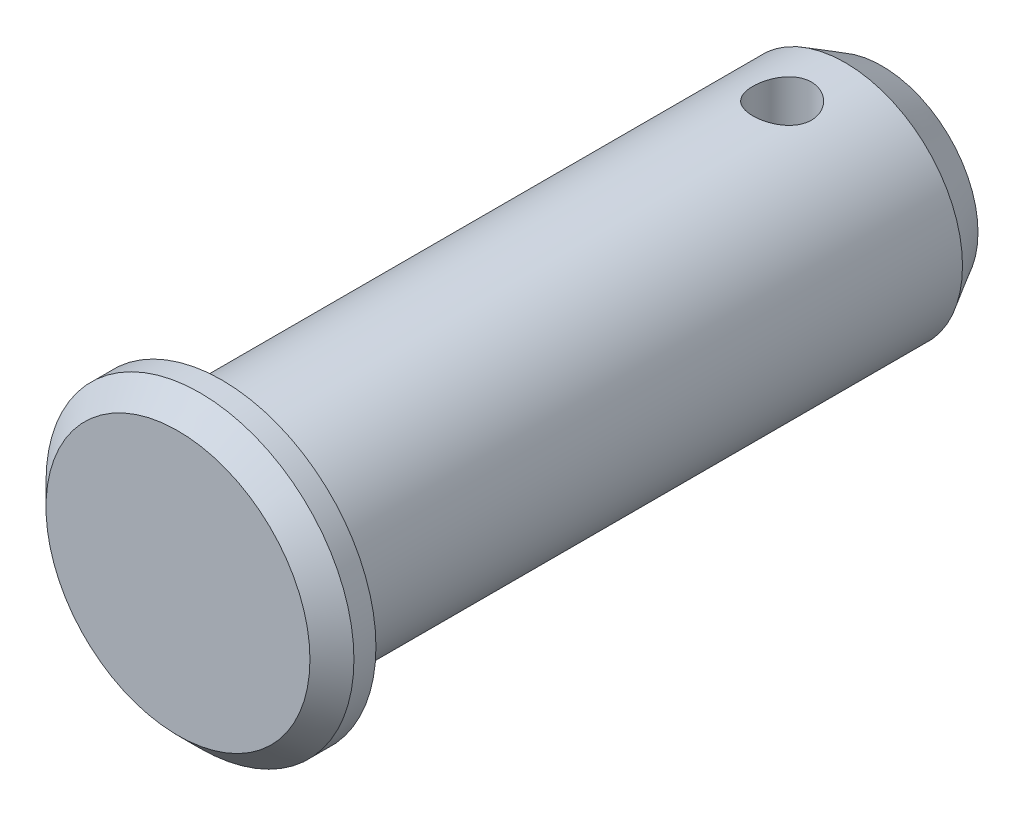
ISO-10303-21;
HEADER;
FILE_DESCRIPTION(('STEP AP214'),'2;1');
FILE_NAME('part.step','',(''),(''),'','','');
FILE_SCHEMA(('AUTOMOTIVE_DESIGN { 1 0 10303 214 1 1 1 1 }'));
ENDSEC;
DATA;
#1=APPLICATION_CONTEXT('core data for automotive mechanical design processes');
#2=APPLICATION_PROTOCOL_DEFINITION('international standard','automotive_design',2000,#1);
#3=PRODUCT_CONTEXT('',#1,'mechanical');
#4=PRODUCT('Part','Part','',(#3));
#5=PRODUCT_RELATED_PRODUCT_CATEGORY('part','',(#4));
#6=PRODUCT_DEFINITION_FORMATION('','',#4);
#7=PRODUCT_DEFINITION_CONTEXT('part definition',#1,'design');
#8=PRODUCT_DEFINITION('design','',#6,#7);
#9=PRODUCT_DEFINITION_SHAPE('','',#8);
#10=(LENGTH_UNIT() NAMED_UNIT(*) SI_UNIT(.MILLI.,.METRE.));
#11=(NAMED_UNIT(*) PLANE_ANGLE_UNIT() SI_UNIT($,.RADIAN.));
#12=(NAMED_UNIT(*) SI_UNIT($,.STERADIAN.) SOLID_ANGLE_UNIT());
#13=UNCERTAINTY_MEASURE_WITH_UNIT(LENGTH_MEASURE(1.E-05),#10,'distance_accuracy_value','');
#14=(GEOMETRIC_REPRESENTATION_CONTEXT(3) GLOBAL_UNCERTAINTY_ASSIGNED_CONTEXT((#13)) GLOBAL_UNIT_ASSIGNED_CONTEXT((#10,
#11,#12)) REPRESENTATION_CONTEXT('',''));
#15=CARTESIAN_POINT('',(0.,0.,0.));
#16=DIRECTION('',(0.,0.,1.));
#17=DIRECTION('',(1.,0.,0.));
#18=AXIS2_PLACEMENT_3D('',#15,#16,#17);
#19=CARTESIAN_POINT('',(0.,0.,24.));
#20=DIRECTION('',(0.,0.,-1.));
#21=DIRECTION('',(-1.,0.,0.));
#22=AXIS2_PLACEMENT_3D('',#19,#20,#21);
#23=PLANE('',#22);
#24=CARTESIAN_POINT('',(0.,0.,24.));
#25=DIRECTION('',(0.,0.,1.));
#26=DIRECTION('',(1.,0.,0.));
#27=AXIS2_PLACEMENT_3D('',#24,#25,#26);
#28=CIRCLE('',#27,9.);
#29=CARTESIAN_POINT('',(9.,0.,24.));
#30=VERTEX_POINT('',#29);
#31=EDGE_CURVE('E10',#30,#30,#28,.T.);
#32=ORIENTED_EDGE('',*,*,#31,.T.);
#33=EDGE_LOOP('',(#32));
#34=FACE_BOUND('',#33,.T.);
#35=ADVANCED_FACE('F33',(#34),#23,.F.);
#36=CARTESIAN_POINT('',(0.,0.,22.5));
#37=DIRECTION('',(0.,0.,-1.));
#38=DIRECTION('',(-1.,0.,0.));
#39=AXIS2_PLACEMENT_3D('',#36,#37,#38);
#40=CONICAL_SURFACE('',#39,10.5,0.785398163397448);
#41=ORIENTED_EDGE('',*,*,#31,.F.);
#42=EDGE_LOOP('',(#41));
#43=FACE_BOUND('',#42,.T.);
#44=CARTESIAN_POINT('',(0.,0.,22.5));
#45=DIRECTION('',(0.,0.,1.));
#46=DIRECTION('',(1.,0.,0.));
#47=AXIS2_PLACEMENT_3D('',#44,#45,#46);
#48=CIRCLE('',#47,10.5);
#49=CARTESIAN_POINT('',(10.5,0.,22.5));
#50=VERTEX_POINT('',#49);
#51=EDGE_CURVE('E45',#50,#50,#48,.T.);
#52=ORIENTED_EDGE('',*,*,#51,.T.);
#53=EDGE_LOOP('',(#52));
#54=FACE_BOUND('',#53,.T.);
#55=ADVANCED_FACE('F82',(#43,#54),#40,.T.);
#56=CARTESIAN_POINT('',(0.,0.,24.));
#57=DIRECTION('',(0.,0.,1.));
#58=DIRECTION('',(1.,0.,0.));
#59=AXIS2_PLACEMENT_3D('',#56,#57,#58);
#60=CYLINDRICAL_SURFACE('',#59,10.5);
#61=ORIENTED_EDGE('',*,*,#51,.F.);
#62=EDGE_LOOP('',(#61));
#63=FACE_BOUND('',#62,.T.);
#64=CARTESIAN_POINT('',(0.,0.,21.));
#65=DIRECTION('',(0.,0.,1.));
#66=DIRECTION('',(1.,0.,0.));
#67=AXIS2_PLACEMENT_3D('',#64,#65,#66);
#68=CIRCLE('',#67,10.5);
#69=CARTESIAN_POINT('',(10.5,0.,21.));
#70=VERTEX_POINT('',#69);
#71=EDGE_CURVE('E50',#70,#70,#68,.T.);
#72=ORIENTED_EDGE('',*,*,#71,.T.);
#73=EDGE_LOOP('',(#72));
#74=FACE_BOUND('',#73,.T.);
#75=ADVANCED_FACE('F86',(#63,#74),#60,.T.);
#76=CARTESIAN_POINT('',(0.,0.,21.));
#77=DIRECTION('',(0.,0.,1.));
#78=DIRECTION('',(1.,0.,0.));
#79=AXIS2_PLACEMENT_3D('',#76,#77,#78);
#80=PLANE('',#79);
#81=ORIENTED_EDGE('',*,*,#71,.F.);
#82=EDGE_LOOP('',(#81));
#83=FACE_BOUND('',#82,.T.);
#84=CARTESIAN_POINT('',(0.,0.,21.));
#85=DIRECTION('',(0.,0.,1.));
#86=DIRECTION('',(1.,0.,0.));
#87=AXIS2_PLACEMENT_3D('',#84,#85,#86);
#88=CIRCLE('',#87,8.);
#89=CARTESIAN_POINT('',(8.,0.,21.));
#90=VERTEX_POINT('',#89);
#91=EDGE_CURVE('E103',#90,#90,#88,.T.);
#92=ORIENTED_EDGE('',*,*,#91,.T.);
#93=EDGE_LOOP('',(#92));
#94=FACE_BOUND('',#93,.T.);
#95=ADVANCED_FACE('F77',(#83,#94),#80,.F.);
#96=CARTESIAN_POINT('',(0.,0.,24.));
#97=DIRECTION('',(0.,0.,1.));
#98=DIRECTION('',(1.,0.,0.));
#99=AXIS2_PLACEMENT_3D('',#96,#97,#98);
#100=CYLINDRICAL_SURFACE('',#99,8.);
#101=CARTESIAN_POINT('',(0.,-8.,-15.2));
#102=CARTESIAN_POINT('',(0.110501451559641,-7.9999981315735,-15.2000031009842));
#103=CARTESIAN_POINT('',(0.221037543774351,-7.99768770842435,-15.2091887343651));
#104=CARTESIAN_POINT('',(0.438941765027377,-7.98869485106526,-15.245633535076));
#105=CARTESIAN_POINT('',(0.546308062494319,-7.98200993893301,-15.2729029460505));
#106=CARTESIAN_POINT('',(0.754694496243435,-7.96500835109376,-15.3445856712828));
#107=CARTESIAN_POINT('',(0.855722084573336,-7.95469603789411,-15.388978398287));
#108=CARTESIAN_POINT('',(1.04889617587257,-7.93153791743495,-15.4935751867265));
#109=CARTESIAN_POINT('',(1.14104237913168,-7.91869202472208,-15.553779781492));
#110=CARTESIAN_POINT('',(1.31573590306789,-7.89156551455591,-15.6896010528722));
#111=CARTESIAN_POINT('',(1.39807425341474,-7.87726276197502,-15.7654820999454));
#112=CARTESIAN_POINT('',(1.54899856960443,-7.84898160157248,-15.9299362732121));
#113=CARTESIAN_POINT('',(1.61758298259892,-7.83500323053157,-16.0185108305959));
#114=CARTESIAN_POINT('',(1.74003539039863,-7.80873034264224,-16.207460302316));
#115=CARTESIAN_POINT('',(1.79366962123352,-7.79646392619748,-16.3079909744116));
#116=CARTESIAN_POINT('',(1.88319587806766,-7.77532659757355,-16.5169978822134));
#117=CARTESIAN_POINT('',(1.91909074058685,-7.76645514259224,-16.6254728444427));
#118=CARTESIAN_POINT('',(1.97140644907302,-7.7533396892843,-16.8449913309356));
#119=CARTESIAN_POINT('',(1.98820302444274,-7.74900654662681,-16.955939861384));
#120=CARTESIAN_POINT('',(2.00301570008854,-7.74519149946122,-17.1791580919991));
#121=CARTESIAN_POINT('',(2.00103485575748,-7.74570880570571,-17.2914275742562));
#122=CARTESIAN_POINT('',(1.97864869951961,-7.75145607355756,-17.5112210769938));
#123=CARTESIAN_POINT('',(1.95869112025418,-7.75657150676391,-17.6187941619538));
#124=CARTESIAN_POINT('',(1.90163224920399,-7.77075612894758,-17.8290147345481));
#125=CARTESIAN_POINT('',(1.86452973609252,-7.77982559958985,-17.9316618707052));
#126=CARTESIAN_POINT('',(1.77385263724958,-7.80100151874212,-18.1303173550028));
#127=CARTESIAN_POINT('',(1.72011555631056,-7.81313769959755,-18.2262482290528));
#128=CARTESIAN_POINT('',(1.59780836801993,-7.83906281127988,-18.4078916130091));
#129=CARTESIAN_POINT('',(1.52923566507845,-7.85285203112837,-18.4936023307563));
#130=CARTESIAN_POINT('',(1.37688456624163,-7.88101174053188,-18.6549381542592));
#131=CARTESIAN_POINT('',(1.29272834422115,-7.89538759304001,-18.7302059867485));
#132=CARTESIAN_POINT('',(1.11281589000493,-7.92274620771675,-18.8656283232852));
#133=CARTESIAN_POINT('',(1.01705930361059,-7.93572892732543,-18.9257823656848));
#134=CARTESIAN_POINT('',(0.816154518241854,-7.9589030945892,-19.0294007816325));
#135=CARTESIAN_POINT('',(0.71097519094483,-7.96908480170303,-19.0728071203392));
#136=CARTESIAN_POINT('',(0.49450134419051,-7.98543889321888,-19.1412230742794));
#137=CARTESIAN_POINT('',(0.383207998867312,-7.99161204452374,-19.1662362085575));
#138=CARTESIAN_POINT('',(0.160719960520035,-7.999139990285,-19.1966100874118));
#139=CARTESIAN_POINT('',(0.0495956266509458,-8.00061404677705,-19.2024573681004));
#140=CARTESIAN_POINT('',(-0.172043833068678,-7.99891739752601,-19.1956679972594));
#141=CARTESIAN_POINT('',(-0.28255901285946,-7.99574710989128,-19.1830330096012));
#142=CARTESIAN_POINT('',(-0.498152358368655,-7.98519441503143,-19.1400387888115));
#143=CARTESIAN_POINT('',(-0.603286825291672,-7.97787512247748,-19.1099449820307));
#144=CARTESIAN_POINT('',(-0.807009723270015,-7.95984942178845,-19.0331905546287));
#145=CARTESIAN_POINT('',(-0.905597492043513,-7.94914267159856,-18.9865282609158));
#146=CARTESIAN_POINT('',(-1.0953641792398,-7.92524410568414,-18.8770184948337));
#147=CARTESIAN_POINT('',(-1.18638058911444,-7.91201156489243,-18.8138985168043));
#148=CARTESIAN_POINT('',(-1.35670215152433,-7.88459345583226,-18.6736134549374));
#149=CARTESIAN_POINT('',(-1.43600527863068,-7.87040772335606,-18.5964459471775));
#150=CARTESIAN_POINT('',(-1.58265409076364,-7.84225275947695,-18.4279973855407));
#151=CARTESIAN_POINT('',(-1.64965849016271,-7.82829738916375,-18.3364163959968));
#152=CARTESIAN_POINT('',(-1.7673476786836,-7.80257171169652,-18.1430231540457));
#153=CARTESIAN_POINT('',(-1.81803319221058,-7.79080130756035,-18.0412113560537));
#154=CARTESIAN_POINT('',(-1.90126856081239,-7.77090792979554,-17.8307923701159));
#155=CARTESIAN_POINT('',(-1.93392586220542,-7.76276340389208,-17.7222298288747));
#156=CARTESIAN_POINT('',(-1.98046087993837,-7.75102325453578,-17.5009204828145));
#157=CARTESIAN_POINT('',(-1.99434270330488,-7.74742663626582,-17.3881745986234));
#158=CARTESIAN_POINT('',(-2.00271812044533,-7.74526534938609,-17.1651719681931));
#159=CARTESIAN_POINT('',(-1.99775719704016,-7.74655910304351,-17.054936753167));
#160=CARTESIAN_POINT('',(-1.96983637108382,-7.7537054534379,-16.8369281484427));
#161=CARTESIAN_POINT('',(-1.94687683024902,-7.75955795855809,-16.7291547093151));
#162=CARTESIAN_POINT('',(-1.88390842592372,-7.77508347576963,-16.5197220545795));
#163=CARTESIAN_POINT('',(-1.84400187290717,-7.78473353648413,-16.4180302596797));
#164=CARTESIAN_POINT('',(-1.74835321814009,-7.80677007633105,-16.2227128230484));
#165=CARTESIAN_POINT('',(-1.69260892004558,-7.81915693494364,-16.1290883024175));
#166=CARTESIAN_POINT('',(-1.56515699818285,-7.8456751235135,-15.9499271613306));
#167=CARTESIAN_POINT('',(-1.493070883883,-7.85984353109009,-15.8646652354347));
#168=CARTESIAN_POINT('',(-1.33571916158631,-7.88810702995048,-15.7072706069395));
#169=CARTESIAN_POINT('',(-1.25045042834819,-7.90220210302746,-15.635141026516));
#170=CARTESIAN_POINT('',(-1.06729011560345,-7.92903540863551,-15.5047849219139));
#171=CARTESIAN_POINT('',(-0.969197896421848,-7.94174444487824,-15.4468338484379));
#172=CARTESIAN_POINT('',(-0.764354746013967,-7.96406566633491,-15.3483367160793));
#173=CARTESIAN_POINT('',(-0.657610084582318,-7.97368006933042,-15.307778185802));
#174=CARTESIAN_POINT('',(-0.459213670991294,-7.98730746087389,-15.2512375595605));
#175=CARTESIAN_POINT('',(-0.368506894544091,-7.99203446736921,-15.2320650092621));
#176=CARTESIAN_POINT('',(-0.185208095381711,-7.99838140309265,-15.2064454085041));
#177=CARTESIAN_POINT('',(-0.0926162149901549,-8.00000156601193,-15.1999974009263));
#178=CARTESIAN_POINT('',(0.,-8.,-15.2));
#179=B_SPLINE_CURVE_WITH_KNOTS('',3,(#101,#102,#103,#104,#105,#106,#107,#108,#109,#110,#111,
#112,#113,#114,#115,#116,#117,#118,#119,#120,#121,#122,#123,#124,#125,#126,#127,#128,#129,#130,
#131,#132,#133,#134,#135,#136,#137,#138,#139,#140,#141,#142,#143,#144,#145,#146,#147,#148,#149,
#150,#151,#152,#153,#154,#155,#156,#157,#158,#159,#160,#161,#162,#163,#164,#165,#166,#167,#168,
#169,#170,#171,#172,#173,#174,#175,#176,#177,#178),.UNSPECIFIED.,.T.,.F.,(4,2,2,2,2,2,2,2,2,2,2,
2,2,2,2,2,2,2,2,2,2,2,2,2,2,2,2,2,2,2,2,2,2,2,2,2,2,2,4),(0.,0.33116494996252,0.662517650351866,
0.99347320304814,1.32443992022577,1.66152580582852,1.99864972773416,2.34078196727743,
2.68285948225824,3.01808393468093,3.3532538415469,3.68029996013785,4.00736937959145,
4.337740371696,4.66816921119311,5.00802001296454,5.34788119415424,5.6889097201658,
6.02987298255951,6.36211078603463,6.69431868154751,7.02160366023144,7.34892169767482,
7.68204783424897,8.01523150681786,8.35659345610395,8.69794025003772,9.03723006156476,
9.37644564340971,9.70591707202578,10.0353818794581,10.3628853408369,10.6904342418696,
11.0265276855098,11.3627009303165,11.7049624733721,12.0469781843289,12.3245632392729,
12.6021274139515),.UNSPECIFIED.);
#180=CARTESIAN_POINT('',(0.,-8.,-15.2));
#181=VERTEX_POINT('',#180);
#182=EDGE_CURVE('E36',#181,#181,#179,.T.);
#183=ORIENTED_EDGE('',*,*,#182,.T.);
#184=EDGE_LOOP('',(#183));
#185=FACE_BOUND('',#184,.T.);
#186=CARTESIAN_POINT('',(0.,8.,-15.2));
#187=CARTESIAN_POINT('',(-0.110501451559642,7.99999813157349,-15.2000031009842));
#188=CARTESIAN_POINT('',(-0.221037543774351,7.99768770842435,-15.2091887343651));
#189=CARTESIAN_POINT('',(-0.438941765027377,7.98869485106526,-15.245633535076));
#190=CARTESIAN_POINT('',(-0.54630806249432,7.98200993893301,-15.2729029460505));
#191=CARTESIAN_POINT('',(-0.754694496243436,7.96500835109376,-15.3445856712828));
#192=CARTESIAN_POINT('',(-0.855722084573336,7.95469603789411,-15.388978398287));
#193=CARTESIAN_POINT('',(-1.04889617587257,7.93153791743495,-15.4935751867265));
#194=CARTESIAN_POINT('',(-1.14104237913169,7.91869202472208,-15.553779781492));
#195=CARTESIAN_POINT('',(-1.31573590306789,7.89156551455591,-15.6896010528722));
#196=CARTESIAN_POINT('',(-1.39807425341474,7.87726276197502,-15.7654820999454));
#197=CARTESIAN_POINT('',(-1.54899856960443,7.84898160157249,-15.9299362732121));
#198=CARTESIAN_POINT('',(-1.61758298259892,7.83500323053157,-16.0185108305959));
#199=CARTESIAN_POINT('',(-1.74003539039863,7.80873034264225,-16.207460302316));
#200=CARTESIAN_POINT('',(-1.79366962123352,7.79646392619748,-16.3079909744116));
#201=CARTESIAN_POINT('',(-1.88319587806766,7.77532659757355,-16.5169978822134));
#202=CARTESIAN_POINT('',(-1.91909074058686,7.76645514259225,-16.6254728444427));
#203=CARTESIAN_POINT('',(-1.97140644907302,7.7533396892843,-16.8449913309356));
#204=CARTESIAN_POINT('',(-1.98820302444274,7.74900654662682,-16.955939861384));
#205=CARTESIAN_POINT('',(-2.00301570008854,7.74519149946122,-17.1791580919991));
#206=CARTESIAN_POINT('',(-2.00103485575748,7.74570880570571,-17.2914275742562));
#207=CARTESIAN_POINT('',(-1.97864869951961,7.75145607355756,-17.5112210769938));
#208=CARTESIAN_POINT('',(-1.95869112025418,7.75657150676392,-17.6187941619538));
#209=CARTESIAN_POINT('',(-1.90163224920399,7.77075612894759,-17.8290147345481));
#210=CARTESIAN_POINT('',(-1.86452973609252,7.77982559958985,-17.9316618707052));
#211=CARTESIAN_POINT('',(-1.77385263724958,7.80100151874212,-18.1303173550028));
#212=CARTESIAN_POINT('',(-1.72011555631056,7.81313769959755,-18.2262482290528));
#213=CARTESIAN_POINT('',(-1.59780836801993,7.83906281127988,-18.4078916130091));
#214=CARTESIAN_POINT('',(-1.52923566507845,7.85285203112837,-18.4936023307563));
#215=CARTESIAN_POINT('',(-1.37688456624163,7.88101174053188,-18.6549381542592));
#216=CARTESIAN_POINT('',(-1.29272834422115,7.89538759304001,-18.7302059867485));
#217=CARTESIAN_POINT('',(-1.11281589000493,7.92274620771675,-18.8656283232852));
#218=CARTESIAN_POINT('',(-1.01705930361059,7.93572892732543,-18.9257823656848));
#219=CARTESIAN_POINT('',(-0.816154518241854,7.9589030945892,-19.0294007816325));
#220=CARTESIAN_POINT('',(-0.71097519094483,7.96908480170303,-19.0728071203392));
#221=CARTESIAN_POINT('',(-0.494501344190509,7.98543889321888,-19.1412230742794));
#222=CARTESIAN_POINT('',(-0.383207998867312,7.99161204452374,-19.1662362085575));
#223=CARTESIAN_POINT('',(-0.160719960520035,7.999139990285,-19.1966100874118));
#224=CARTESIAN_POINT('',(-0.0495956266509456,8.00061404677705,-19.2024573681004));
#225=CARTESIAN_POINT('',(0.172043833068678,7.99891739752601,-19.1956679972594));
#226=CARTESIAN_POINT('',(0.282559012859461,7.99574710989128,-19.1830330096012));
#227=CARTESIAN_POINT('',(0.498152358368656,7.98519441503143,-19.1400387888115));
#228=CARTESIAN_POINT('',(0.603286825291674,7.97787512247748,-19.1099449820307));
#229=CARTESIAN_POINT('',(0.807009723270016,7.95984942178845,-19.0331905546287));
#230=CARTESIAN_POINT('',(0.905597492043514,7.94914267159856,-18.9865282609158));
#231=CARTESIAN_POINT('',(1.0953641792398,7.92524410568414,-18.8770184948337));
#232=CARTESIAN_POINT('',(1.18638058911444,7.91201156489243,-18.8138985168043));
#233=CARTESIAN_POINT('',(1.35670215152433,7.88459345583226,-18.6736134549374));
#234=CARTESIAN_POINT('',(1.43600527863068,7.87040772335606,-18.5964459471775));
#235=CARTESIAN_POINT('',(1.58265409076364,7.84225275947695,-18.4279973855407));
#236=CARTESIAN_POINT('',(1.64965849016271,7.82829738916374,-18.3364163959968));
#237=CARTESIAN_POINT('',(1.7673476786836,7.80257171169651,-18.1430231540457));
#238=CARTESIAN_POINT('',(1.81803319221058,7.79080130756035,-18.0412113560537));
#239=CARTESIAN_POINT('',(1.90126856081239,7.77090792979553,-17.8307923701159));
#240=CARTESIAN_POINT('',(1.93392586220542,7.76276340389207,-17.7222298288747));
#241=CARTESIAN_POINT('',(1.98046087993837,7.75102325453578,-17.5009204828145));
#242=CARTESIAN_POINT('',(1.99434270330488,7.74742663626581,-17.3881745986234));
#243=CARTESIAN_POINT('',(2.00271812044533,7.74526534938609,-17.1651719681931));
#244=CARTESIAN_POINT('',(1.99775719704016,7.74655910304351,-17.054936753167));
#245=CARTESIAN_POINT('',(1.96983637108382,7.7537054534379,-16.8369281484427));
#246=CARTESIAN_POINT('',(1.94687683024902,7.75955795855809,-16.7291547093151));
#247=CARTESIAN_POINT('',(1.88390842592372,7.77508347576963,-16.5197220545795));
#248=CARTESIAN_POINT('',(1.84400187290717,7.78473353648412,-16.4180302596797));
#249=CARTESIAN_POINT('',(1.74835321814009,7.80677007633105,-16.2227128230484));
#250=CARTESIAN_POINT('',(1.69260892004559,7.81915693494364,-16.1290883024175));
#251=CARTESIAN_POINT('',(1.56515699818285,7.84567512351349,-15.9499271613306));
#252=CARTESIAN_POINT('',(1.49307088388301,7.85984353109009,-15.8646652354347));
#253=CARTESIAN_POINT('',(1.33571916158632,7.88810702995047,-15.7072706069395));
#254=CARTESIAN_POINT('',(1.2504504283482,7.90220210302746,-15.635141026516));
#255=CARTESIAN_POINT('',(1.06729011560345,7.9290354086355,-15.5047849219139));
#256=CARTESIAN_POINT('',(0.96919789642185,7.94174444487824,-15.4468338484379));
#257=CARTESIAN_POINT('',(0.764354746013969,7.96406566633491,-15.3483367160793));
#258=CARTESIAN_POINT('',(0.65761008458232,7.97368006933042,-15.307778185802));
#259=CARTESIAN_POINT('',(0.459213670991297,7.98730746087389,-15.2512375595605));
#260=CARTESIAN_POINT('',(0.368506894544093,7.99203446736921,-15.2320650092621));
#261=CARTESIAN_POINT('',(0.185208095381712,7.99838140309264,-15.2064454085041));
#262=CARTESIAN_POINT('',(0.0926162149901555,8.00000156601192,-15.1999974009263));
#263=CARTESIAN_POINT('',(0.,8.,-15.2));
#264=B_SPLINE_CURVE_WITH_KNOTS('',3,(#186,#187,#188,#189,#190,#191,#192,#193,#194,#195,#196,
#197,#198,#199,#200,#201,#202,#203,#204,#205,#206,#207,#208,#209,#210,#211,#212,#213,#214,#215,
#216,#217,#218,#219,#220,#221,#222,#223,#224,#225,#226,#227,#228,#229,#230,#231,#232,#233,#234,
#235,#236,#237,#238,#239,#240,#241,#242,#243,#244,#245,#246,#247,#248,#249,#250,#251,#252,#253,
#254,#255,#256,#257,#258,#259,#260,#261,#262,#263),.UNSPECIFIED.,.T.,.F.,(4,2,2,2,2,2,2,2,2,2,2,
2,2,2,2,2,2,2,2,2,2,2,2,2,2,2,2,2,2,2,2,2,2,2,2,2,2,2,4),(0.,0.33116494996252,0.662517650351866,
0.993473203048141,1.32443992022577,1.66152580582852,1.99864972773416,2.34078196727743,
2.68285948225825,3.01808393468093,3.3532538415469,3.68029996013785,4.00736937959145,
4.337740371696,4.66816921119311,5.00802001296454,5.34788119415424,5.6889097201658,
6.02987298255952,6.36211078603463,6.69431868154752,7.02160366023144,7.34892169767482,
7.68204783424897,8.01523150681787,8.35659345610396,8.69794025003772,9.03723006156476,
9.37644564340972,9.70591707202578,10.0353818794581,10.3628853408369,10.6904342418696,
11.0265276855097,11.3627009303165,11.7049624733721,12.0469781843289,12.3245632392729,
12.6021274139515),.UNSPECIFIED.);
#265=CARTESIAN_POINT('',(0.,8.,-15.2));
#266=VERTEX_POINT('',#265);
#267=EDGE_CURVE('E53',#266,#266,#264,.T.);
#268=ORIENTED_EDGE('',*,*,#267,.T.);
#269=EDGE_LOOP('',(#268));
#270=FACE_BOUND('',#269,.T.);
#271=ORIENTED_EDGE('',*,*,#91,.F.);
#272=EDGE_LOOP('',(#271));
#273=FACE_BOUND('',#272,.T.);
#274=CARTESIAN_POINT('',(0.,0.,-21.5));
#275=DIRECTION('',(0.,0.,1.));
#276=DIRECTION('',(1.,0.,0.));
#277=AXIS2_PLACEMENT_3D('',#274,#275,#276);
#278=CIRCLE('',#277,8.);
#279=CARTESIAN_POINT('',(8.,0.,-21.5));
#280=VERTEX_POINT('',#279);
#281=EDGE_CURVE('E105',#280,#280,#278,.T.);
#282=ORIENTED_EDGE('',*,*,#281,.T.);
#283=EDGE_LOOP('',(#282));
#284=FACE_BOUND('',#283,.T.);
#285=ADVANCED_FACE('F58',(#185,#270,#273,#284),#100,.T.);
#286=CARTESIAN_POINT('',(0.,0.,-24.));
#287=DIRECTION('',(0.,0.,1.));
#288=DIRECTION('',(1.,0.,0.));
#289=AXIS2_PLACEMENT_3D('',#286,#287,#288);
#290=CONICAL_SURFACE('',#289,6.55662432702594,0.523598775598297);
#291=ORIENTED_EDGE('',*,*,#281,.F.);
#292=EDGE_LOOP('',(#291));
#293=FACE_BOUND('',#292,.T.);
#294=CARTESIAN_POINT('',(0.,0.,-24.));
#295=DIRECTION('',(0.,0.,1.));
#296=DIRECTION('',(1.,0.,0.));
#297=AXIS2_PLACEMENT_3D('',#294,#295,#296);
#298=CIRCLE('',#297,6.55662432702594);
#299=CARTESIAN_POINT('',(6.55662432702594,0.,-24.));
#300=VERTEX_POINT('',#299);
#301=EDGE_CURVE('E108',#300,#300,#298,.T.);
#302=ORIENTED_EDGE('',*,*,#301,.T.);
#303=EDGE_LOOP('',(#302));
#304=FACE_BOUND('',#303,.T.);
#305=ADVANCED_FACE('F70',(#293,#304),#290,.T.);
#306=CARTESIAN_POINT('',(0.,0.,-24.));
#307=DIRECTION('',(0.,0.,1.));
#308=DIRECTION('',(1.,0.,0.));
#309=AXIS2_PLACEMENT_3D('',#306,#307,#308);
#310=PLANE('',#309);
#311=ORIENTED_EDGE('',*,*,#301,.F.);
#312=EDGE_LOOP('',(#311));
#313=FACE_BOUND('',#312,.T.);
#314=ADVANCED_FACE('F66',(#313),#310,.F.);
#315=CARTESIAN_POINT('',(0.,-10.5,-17.2));
#316=DIRECTION('',(0.,1.,0.));
#317=DIRECTION('',(0.,0.,1.));
#318=AXIS2_PLACEMENT_3D('',#315,#316,#317);
#319=CYLINDRICAL_SURFACE('',#318,2.);
#320=ORIENTED_EDGE('',*,*,#267,.F.);
#321=EDGE_LOOP('',(#320));
#322=FACE_BOUND('',#321,.T.);
#323=ORIENTED_EDGE('',*,*,#182,.F.);
#324=EDGE_LOOP('',(#323));
#325=FACE_BOUND('',#324,.T.);
#326=ADVANCED_FACE('F62',(#322,#325),#319,.F.);
#327=CLOSED_SHELL('',(#35,#55,#75,#95,#285,#305,#314,#326));
#328=MANIFOLD_SOLID_BREP('B2',#327);
#329=ADVANCED_BREP_SHAPE_REPRESENTATION('',(#18,#328),#14);
#330=SHAPE_DEFINITION_REPRESENTATION(#9,#329);
ENDSEC;
END-ISO-10303-21;
